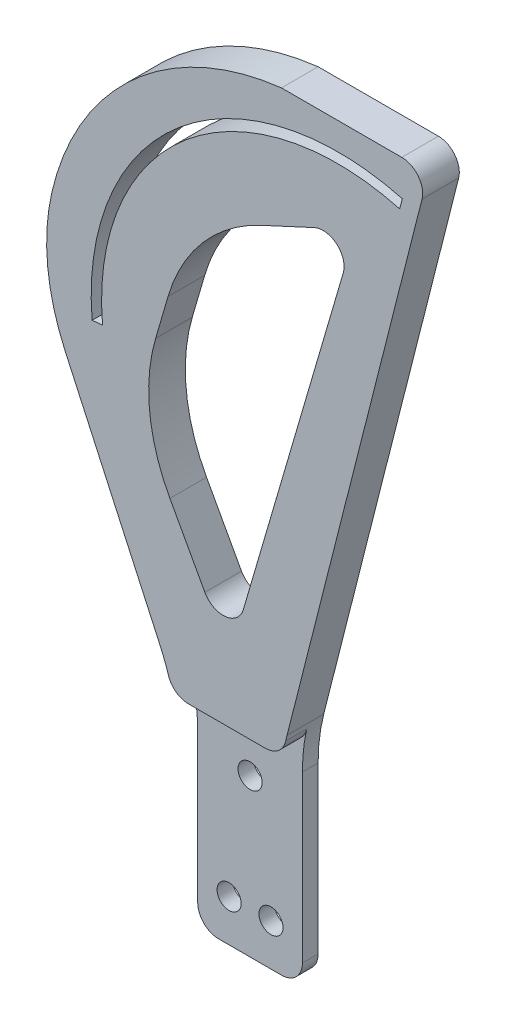
ISO-10303-21;
HEADER;
FILE_DESCRIPTION(('STEP AP214'),'2;1');
FILE_NAME('part.step','',(''),(''),'','','');
FILE_SCHEMA(('AUTOMOTIVE_DESIGN { 1 0 10303 214 1 1 1 1 }'));
ENDSEC;
DATA;
#1=APPLICATION_CONTEXT('core data for automotive mechanical design processes');
#2=APPLICATION_PROTOCOL_DEFINITION('international standard','automotive_design',2000,#1);
#3=PRODUCT_CONTEXT('',#1,'mechanical');
#4=PRODUCT('Part','Part','',(#3));
#5=PRODUCT_RELATED_PRODUCT_CATEGORY('part','',(#4));
#6=PRODUCT_DEFINITION_FORMATION('','',#4);
#7=PRODUCT_DEFINITION_CONTEXT('part definition',#1,'design');
#8=PRODUCT_DEFINITION('design','',#6,#7);
#9=PRODUCT_DEFINITION_SHAPE('','',#8);
#10=(LENGTH_UNIT() NAMED_UNIT(*) SI_UNIT(.MILLI.,.METRE.));
#11=(NAMED_UNIT(*) PLANE_ANGLE_UNIT() SI_UNIT($,.RADIAN.));
#12=(NAMED_UNIT(*) SI_UNIT($,.STERADIAN.) SOLID_ANGLE_UNIT());
#13=UNCERTAINTY_MEASURE_WITH_UNIT(LENGTH_MEASURE(1.E-05),#10,'distance_accuracy_value','');
#14=(GEOMETRIC_REPRESENTATION_CONTEXT(3) GLOBAL_UNCERTAINTY_ASSIGNED_CONTEXT((#13)) GLOBAL_UNIT_ASSIGNED_CONTEXT((#10,
#11,#12)) REPRESENTATION_CONTEXT('',''));
#15=CARTESIAN_POINT('',(0.,0.,0.));
#16=DIRECTION('',(0.,0.,1.));
#17=DIRECTION('',(1.,0.,0.));
#18=AXIS2_PLACEMENT_3D('',#15,#16,#17);
#19=CARTESIAN_POINT('',(10.,40.,7.));
#20=DIRECTION('',(-1.,0.,0.));
#21=DIRECTION('',(0.,0.,1.));
#22=AXIS2_PLACEMENT_3D('',#19,#20,#21);
#23=PLANE('',#22);
#24=DIRECTION('',(0.,1.,0.));
#25=VECTOR('',#24,1.);
#26=CARTESIAN_POINT('',(10.,40.,3.));
#27=LINE('',#26,#25);
#28=CARTESIAN_POINT('',(10.,4.,3.));
#29=VERTEX_POINT('',#28);
#30=CARTESIAN_POINT('',(10.,35.6273984666318,3.));
#31=VERTEX_POINT('',#30);
#32=EDGE_CURVE('E242',#29,#31,#27,.T.);
#33=ORIENTED_EDGE('',*,*,#32,.F.);
#34=DIRECTION('',(0.,0.,-1.));
#35=VECTOR('',#34,1.);
#36=CARTESIAN_POINT('',(10.,4.,7.));
#37=LINE('',#36,#35);
#38=CARTESIAN_POINT('',(10.,4.,0.));
#39=VERTEX_POINT('',#38);
#40=EDGE_CURVE('E251',#29,#39,#37,.T.);
#41=ORIENTED_EDGE('',*,*,#40,.T.);
#42=DIRECTION('',(0.,1.,0.));
#43=VECTOR('',#42,1.);
#44=CARTESIAN_POINT('',(10.,40.,0.));
#45=LINE('',#44,#43);
#46=CARTESIAN_POINT('',(10.,35.6273984666318,0.));
#47=VERTEX_POINT('',#46);
#48=EDGE_CURVE('E342',#39,#47,#45,.T.);
#49=ORIENTED_EDGE('',*,*,#48,.T.);
#50=DIRECTION('',(0.,0.,-1.));
#51=VECTOR('',#50,1.);
#52=CARTESIAN_POINT('',(10.,35.6273984666318,7.));
#53=LINE('',#52,#51);
#54=EDGE_CURVE('E283',#47,#31,#53,.F.);
#55=ORIENTED_EDGE('',*,*,#54,.T.);
#56=EDGE_LOOP('',(#33,#41,#49,#55));
#57=FACE_BOUND('',#56,.T.);
#58=ADVANCED_FACE('F31',(#57),#23,.F.);
#59=CARTESIAN_POINT('',(-10.,0.,7.));
#60=DIRECTION('',(1.,0.,0.));
#61=DIRECTION('',(0.,0.,-1.));
#62=AXIS2_PLACEMENT_3D('',#59,#60,#61);
#63=PLANE('',#62);
#64=DIRECTION('',(0.,-1.,0.));
#65=VECTOR('',#64,1.);
#66=CARTESIAN_POINT('',(-10.,0.,3.));
#67=LINE('',#66,#65);
#68=CARTESIAN_POINT('',(-10.,32.3714301403582,3.));
#69=VERTEX_POINT('',#68);
#70=CARTESIAN_POINT('',(-10.,4.,3.));
#71=VERTEX_POINT('',#70);
#72=EDGE_CURVE('E227',#69,#71,#67,.T.);
#73=ORIENTED_EDGE('',*,*,#72,.F.);
#74=DIRECTION('',(0.,0.,-1.));
#75=VECTOR('',#74,1.);
#76=CARTESIAN_POINT('',(-10.,32.3714301403582,0.));
#77=LINE('',#76,#75);
#78=CARTESIAN_POINT('',(-10.,32.3714301403582,0.));
#79=VERTEX_POINT('',#78);
#80=EDGE_CURVE('E276',#69,#79,#77,.T.);
#81=ORIENTED_EDGE('',*,*,#80,.T.);
#82=DIRECTION('',(0.,-1.,0.));
#83=VECTOR('',#82,1.);
#84=CARTESIAN_POINT('',(-10.,0.,0.));
#85=LINE('',#84,#83);
#86=CARTESIAN_POINT('',(-10.,4.,0.));
#87=VERTEX_POINT('',#86);
#88=EDGE_CURVE('E356',#79,#87,#85,.T.);
#89=ORIENTED_EDGE('',*,*,#88,.T.);
#90=DIRECTION('',(0.,0.,-1.));
#91=VECTOR('',#90,1.);
#92=CARTESIAN_POINT('',(-10.,4.,7.));
#93=LINE('',#92,#91);
#94=EDGE_CURVE('E249',#87,#71,#93,.F.);
#95=ORIENTED_EDGE('',*,*,#94,.T.);
#96=EDGE_LOOP('',(#73,#81,#89,#95));
#97=FACE_BOUND('',#96,.T.);
#98=ADVANCED_FACE('F424',(#97),#63,.F.);
#99=CARTESIAN_POINT('',(-10.,0.,7.));
#100=DIRECTION('',(0.,1.,0.));
#101=DIRECTION('',(0.,0.,1.));
#102=AXIS2_PLACEMENT_3D('',#99,#100,#101);
#103=PLANE('',#102);
#104=DIRECTION('',(1.,0.,0.));
#105=VECTOR('',#104,1.);
#106=CARTESIAN_POINT('',(16.3557713550586,0.,3.));
#107=LINE('',#106,#105);
#108=CARTESIAN_POINT('',(-6.,0.,3.));
#109=VERTEX_POINT('',#108);
#110=CARTESIAN_POINT('',(6.,0.,3.));
#111=VERTEX_POINT('',#110);
#112=EDGE_CURVE('E224',#109,#111,#107,.T.);
#113=ORIENTED_EDGE('',*,*,#112,.F.);
#114=DIRECTION('',(0.,0.,-1.));
#115=VECTOR('',#114,1.);
#116=CARTESIAN_POINT('',(-6.,0.,7.));
#117=LINE('',#116,#115);
#118=CARTESIAN_POINT('',(-6.,0.,0.));
#119=VERTEX_POINT('',#118);
#120=EDGE_CURVE('E238',#109,#119,#117,.T.);
#121=ORIENTED_EDGE('',*,*,#120,.T.);
#122=DIRECTION('',(1.,0.,0.));
#123=VECTOR('',#122,1.);
#124=CARTESIAN_POINT('',(-10.,0.,0.));
#125=LINE('',#124,#123);
#126=CARTESIAN_POINT('',(6.,0.,0.));
#127=VERTEX_POINT('',#126);
#128=EDGE_CURVE('E358',#119,#127,#125,.T.);
#129=ORIENTED_EDGE('',*,*,#128,.T.);
#130=DIRECTION('',(0.,0.,-1.));
#131=VECTOR('',#130,1.);
#132=CARTESIAN_POINT('',(6.,0.,7.));
#133=LINE('',#132,#131);
#134=EDGE_CURVE('E241',#127,#111,#133,.F.);
#135=ORIENTED_EDGE('',*,*,#134,.T.);
#136=EDGE_LOOP('',(#113,#121,#129,#135));
#137=FACE_BOUND('',#136,.T.);
#138=ADVANCED_FACE('F236',(#137),#103,.F.);
#139=CARTESIAN_POINT('',(0.,30.,7.));
#140=DIRECTION('',(0.,0.,-1.));
#141=DIRECTION('',(-1.,0.,0.));
#142=AXIS2_PLACEMENT_3D('',#139,#140,#141);
#143=CYLINDRICAL_SURFACE('',#142,2.3);
#144=CARTESIAN_POINT('',(0.,30.,0.));
#145=DIRECTION('',(0.,0.,1.));
#146=DIRECTION('',(1.,0.,0.));
#147=AXIS2_PLACEMENT_3D('',#144,#145,#146);
#148=CIRCLE('',#147,2.3);
#149=CARTESIAN_POINT('',(2.3,30.,0.));
#150=VERTEX_POINT('',#149);
#151=EDGE_CURVE('E475',#150,#150,#148,.T.);
#152=ORIENTED_EDGE('',*,*,#151,.F.);
#153=EDGE_LOOP('',(#152));
#154=FACE_BOUND('',#153,.T.);
#155=CARTESIAN_POINT('',(0.,30.,3.));
#156=DIRECTION('',(0.,0.,1.));
#157=DIRECTION('',(1.,0.,0.));
#158=AXIS2_PLACEMENT_3D('',#155,#156,#157);
#159=CIRCLE('',#158,2.3);
#160=CARTESIAN_POINT('',(2.3,30.,3.));
#161=VERTEX_POINT('',#160);
#162=EDGE_CURVE('E435',#161,#161,#159,.T.);
#163=ORIENTED_EDGE('',*,*,#162,.T.);
#164=EDGE_LOOP('',(#163));
#165=FACE_BOUND('',#164,.T.);
#166=ADVANCED_FACE('F621',(#154,#165),#143,.F.);
#167=CARTESIAN_POINT('',(4.,8.,7.));
#168=DIRECTION('',(0.,0.,-1.));
#169=DIRECTION('',(-1.,0.,0.));
#170=AXIS2_PLACEMENT_3D('',#167,#168,#169);
#171=CYLINDRICAL_SURFACE('',#170,2.3);
#172=CARTESIAN_POINT('',(4.,8.,0.));
#173=DIRECTION('',(0.,0.,1.));
#174=DIRECTION('',(1.,0.,0.));
#175=AXIS2_PLACEMENT_3D('',#172,#173,#174);
#176=CIRCLE('',#175,2.3);
#177=CARTESIAN_POINT('',(6.3,8.,0.));
#178=VERTEX_POINT('',#177);
#179=EDGE_CURVE('E472',#178,#178,#176,.T.);
#180=ORIENTED_EDGE('',*,*,#179,.F.);
#181=EDGE_LOOP('',(#180));
#182=FACE_BOUND('',#181,.T.);
#183=CARTESIAN_POINT('',(4.,8.,3.));
#184=DIRECTION('',(0.,0.,1.));
#185=DIRECTION('',(1.,0.,0.));
#186=AXIS2_PLACEMENT_3D('',#183,#184,#185);
#187=CIRCLE('',#186,2.3);
#188=CARTESIAN_POINT('',(6.3,8.,3.));
#189=VERTEX_POINT('',#188);
#190=EDGE_CURVE('E432',#189,#189,#187,.T.);
#191=ORIENTED_EDGE('',*,*,#190,.T.);
#192=EDGE_LOOP('',(#191));
#193=FACE_BOUND('',#192,.T.);
#194=ADVANCED_FACE('F617',(#182,#193),#171,.F.);
#195=CARTESIAN_POINT('',(-4.,8.,7.));
#196=DIRECTION('',(0.,0.,-1.));
#197=DIRECTION('',(-1.,0.,0.));
#198=AXIS2_PLACEMENT_3D('',#195,#196,#197);
#199=CYLINDRICAL_SURFACE('',#198,2.3);
#200=CARTESIAN_POINT('',(-4.,8.,0.));
#201=DIRECTION('',(0.,0.,1.));
#202=DIRECTION('',(1.,0.,0.));
#203=AXIS2_PLACEMENT_3D('',#200,#201,#202);
#204=CIRCLE('',#203,2.3);
#205=CARTESIAN_POINT('',(-1.7,8.,0.));
#206=VERTEX_POINT('',#205);
#207=EDGE_CURVE('E469',#206,#206,#204,.T.);
#208=ORIENTED_EDGE('',*,*,#207,.F.);
#209=EDGE_LOOP('',(#208));
#210=FACE_BOUND('',#209,.T.);
#211=CARTESIAN_POINT('',(-4.,8.,3.));
#212=DIRECTION('',(0.,0.,1.));
#213=DIRECTION('',(1.,0.,0.));
#214=AXIS2_PLACEMENT_3D('',#211,#212,#213);
#215=CIRCLE('',#214,2.3);
#216=CARTESIAN_POINT('',(-1.7,8.,3.));
#217=VERTEX_POINT('',#216);
#218=EDGE_CURVE('E232',#217,#217,#215,.T.);
#219=ORIENTED_EDGE('',*,*,#218,.T.);
#220=EDGE_LOOP('',(#219));
#221=FACE_BOUND('',#220,.T.);
#222=ADVANCED_FACE('F571',(#210,#221),#199,.F.);
#223=CARTESIAN_POINT('',(-6.,4.,7.));
#224=DIRECTION('',(0.,0.,-1.));
#225=DIRECTION('',(-1.,0.,0.));
#226=AXIS2_PLACEMENT_3D('',#223,#224,#225);
#227=CYLINDRICAL_SURFACE('',#226,4.);
#228=ORIENTED_EDGE('',*,*,#120,.F.);
#229=CARTESIAN_POINT('',(-6.,4.,3.));
#230=DIRECTION('',(0.,0.,1.));
#231=DIRECTION('',(1.,0.,0.));
#232=AXIS2_PLACEMENT_3D('',#229,#230,#231);
#233=CIRCLE('',#232,4.);
#234=EDGE_CURVE('E221',#109,#71,#233,.F.);
#235=ORIENTED_EDGE('',*,*,#234,.T.);
#236=ORIENTED_EDGE('',*,*,#94,.F.);
#237=CARTESIAN_POINT('',(-6.,4.,0.));
#238=DIRECTION('',(0.,0.,1.));
#239=DIRECTION('',(1.,0.,0.));
#240=AXIS2_PLACEMENT_3D('',#237,#238,#239);
#241=CIRCLE('',#240,4.);
#242=EDGE_CURVE('E247',#119,#87,#241,.F.);
#243=ORIENTED_EDGE('',*,*,#242,.F.);
#244=EDGE_LOOP('',(#228,#235,#236,#243));
#245=FACE_BOUND('',#244,.T.);
#246=ADVANCED_FACE('F245',(#245),#227,.T.);
#247=CARTESIAN_POINT('',(6.,4.,7.));
#248=DIRECTION('',(0.,0.,-1.));
#249=DIRECTION('',(-1.,0.,0.));
#250=AXIS2_PLACEMENT_3D('',#247,#248,#249);
#251=CYLINDRICAL_SURFACE('',#250,4.);
#252=ORIENTED_EDGE('',*,*,#40,.F.);
#253=CARTESIAN_POINT('',(6.,4.,3.));
#254=DIRECTION('',(0.,0.,1.));
#255=DIRECTION('',(1.,0.,0.));
#256=AXIS2_PLACEMENT_3D('',#253,#254,#255);
#257=CIRCLE('',#256,4.);
#258=EDGE_CURVE('E426',#29,#111,#257,.F.);
#259=ORIENTED_EDGE('',*,*,#258,.T.);
#260=ORIENTED_EDGE('',*,*,#134,.F.);
#261=CARTESIAN_POINT('',(6.,4.,0.));
#262=DIRECTION('',(0.,0.,1.));
#263=DIRECTION('',(1.,0.,0.));
#264=AXIS2_PLACEMENT_3D('',#261,#262,#263);
#265=CIRCLE('',#264,4.);
#266=EDGE_CURVE('E389',#39,#127,#265,.F.);
#267=ORIENTED_EDGE('',*,*,#266,.F.);
#268=EDGE_LOOP('',(#252,#259,#260,#267));
#269=FACE_BOUND('',#268,.T.);
#270=ADVANCED_FACE('F570',(#269),#251,.T.);
#271=CARTESIAN_POINT('',(15.8483914987407,100.113681249051,7.));
#272=DIRECTION('',(0.,0.,1.));
#273=DIRECTION('',(1.,0.,0.));
#274=AXIS2_PLACEMENT_3D('',#271,#272,#273);
#275=PLANE('',#274);
#276=CARTESIAN_POINT('',(-45.,32.3714301403582,7.));
#277=DIRECTION('',(0.,0.,1.));
#278=DIRECTION('',(1.,0.,0.));
#279=AXIS2_PLACEMENT_3D('',#276,#277,#278);
#280=CIRCLE('',#279,35.);
#281=CARTESIAN_POINT('',(-13.1746189934436,46.9366326376638,7.));
#282=VERTEX_POINT('',#281);
#283=CARTESIAN_POINT('',(-11.5920357684698,42.8073261682419,7.));
#284=VERTEX_POINT('',#283);
#285=EDGE_CURVE('E288',#282,#284,#280,.F.);
#286=ORIENTED_EDGE('',*,*,#285,.T.);
#287=CARTESIAN_POINT('',(-7.77398271343778,44.,7.));
#288=DIRECTION('',(0.,0.,1.));
#289=DIRECTION('',(1.,0.,0.));
#290=AXIS2_PLACEMENT_3D('',#287,#288,#289);
#291=CIRCLE('',#290,4.);
#292=CARTESIAN_POINT('',(-7.77398271343778,40.,7.));
#293=VERTEX_POINT('',#292);
#294=EDGE_CURVE('E301',#284,#293,#291,.T.);
#295=ORIENTED_EDGE('',*,*,#294,.T.);
#296=DIRECTION('',(-1.,0.,0.));
#297=VECTOR('',#296,1.);
#298=CARTESIAN_POINT('',(16.3557713550586,40.,7.));
#299=LINE('',#298,#297);
#300=CARTESIAN_POINT('',(6.90932471636347,40.,7.));
#301=VERTEX_POINT('',#300);
#302=EDGE_CURVE('E852',#301,#293,#299,.T.);
#303=ORIENTED_EDGE('',*,*,#302,.F.);
#304=CARTESIAN_POINT('',(6.90932471636347,44.,7.));
#305=DIRECTION('',(0.,0.,1.));
#306=DIRECTION('',(1.,0.,0.));
#307=AXIS2_PLACEMENT_3D('',#304,#305,#306);
#308=CIRCLE('',#307,4.);
#309=CARTESIAN_POINT('',(10.8160606428903,43.1412716376033,7.));
#310=VERTEX_POINT('',#309);
#311=EDGE_CURVE('E299',#301,#310,#308,.T.);
#312=ORIENTED_EDGE('',*,*,#311,.T.);
#313=CARTESIAN_POINT('',(45.,35.6273984666318,7.));
#314=DIRECTION('',(0.,0.,1.));
#315=DIRECTION('',(1.,0.,0.));
#316=AXIS2_PLACEMENT_3D('',#313,#314,#315);
#317=CIRCLE('',#316,35.);
#318=CARTESIAN_POINT('',(11.0757607583363,44.2382051578986,7.));
#319=VERTEX_POINT('',#318);
#320=EDGE_CURVE('E293',#310,#319,#317,.F.);
#321=ORIENTED_EDGE('',*,*,#320,.T.);
#322=DIRECTION('',(0.246023048321909,0.969263978333248,0.));
#323=VECTOR('',#322,1.);
#324=CARTESIAN_POINT('',(38.1230361732267,150.797122911854,7.));
#325=LINE('',#324,#323);
#326=CARTESIAN_POINT('',(36.8579509313108,145.813030718567,7.));
#327=VERTEX_POINT('',#326);
#328=EDGE_CURVE('E359',#319,#327,#325,.T.);
#329=ORIENTED_EDGE('',*,*,#328,.T.);
#330=CARTESIAN_POINT('',(32.9808950179779,146.797122911854,7.));
#331=DIRECTION('',(0.,0.,1.));
#332=DIRECTION('',(1.,0.,0.));
#333=AXIS2_PLACEMENT_3D('',#330,#331,#332);
#334=CIRCLE('',#333,4.);
#335=CARTESIAN_POINT('',(32.9808950179779,150.797122911854,7.));
#336=VERTEX_POINT('',#335);
#337=EDGE_CURVE('E253',#327,#336,#334,.T.);
#338=ORIENTED_EDGE('',*,*,#337,.T.);
#339=DIRECTION('',(-1.,0.,0.));
#340=VECTOR('',#339,1.);
#341=CARTESIAN_POINT('',(10.,150.797122911854,7.));
#342=LINE('',#341,#340);
#343=CARTESIAN_POINT('',(10.,150.797122911854,7.));
#344=VERTEX_POINT('',#343);
#345=EDGE_CURVE('E338',#336,#344,#342,.T.);
#346=ORIENTED_EDGE('',*,*,#345,.T.);
#347=CARTESIAN_POINT('',(15.8483914987407,100.113681249051,7.));
#348=DIRECTION('',(0.,0.,1.));
#349=DIRECTION('',(1.,0.,0.));
#350=AXIS2_PLACEMENT_3D('',#347,#348,#349);
#351=CIRCLE('',#350,51.0197505081054);
#352=CARTESIAN_POINT('',(-33.85729029443,111.61846892138,7.));
#353=VERTEX_POINT('',#352);
#354=EDGE_CURVE('E333',#344,#353,#351,.T.);
#355=ORIENTED_EDGE('',*,*,#354,.T.);
#356=CARTESIAN_POINT('',(4.13822263199424,102.824095864821,7.));
#357=DIRECTION('',(0.,0.,1.));
#358=DIRECTION('',(1.,0.,0.));
#359=AXIS2_PLACEMENT_3D('',#356,#357,#358);
#360=CIRCLE('',#359,39.);
#361=CARTESIAN_POINT('',(-31.3243447753115,86.594298796395,7.));
#362=VERTEX_POINT('',#361);
#363=EDGE_CURVE('E328',#353,#362,#360,.T.);
#364=ORIENTED_EDGE('',*,*,#363,.T.);
#365=DIRECTION('',(0.416148642780162,-0.909296600187326,0.));
#366=VECTOR('',#365,1.);
#367=CARTESIAN_POINT('',(-34.8350501640625,94.26528975031,7.));
#368=LINE('',#367,#366);
#369=EDGE_CURVE('E325',#362,#282,#368,.T.);
#370=ORIENTED_EDGE('',*,*,#369,.T.);
#371=EDGE_LOOP('',(#286,#295,#303,#312,#321,#329,#338,#346,#355,#364,#370));
#372=FACE_BOUND('',#371,.T.);
#373=DIRECTION('',(-0.28080661807716,-0.959764368605163,0.));
#374=VECTOR('',#373,1.);
#375=CARTESIAN_POINT('',(-17.8772836180474,84.2204503935574,7.));
#376=LINE('',#375,#374);
#377=CARTESIAN_POINT('',(-11.6665246986277,105.448102197753,7.));
#378=VERTEX_POINT('',#377);
#379=CARTESIAN_POINT('',(-14.0389246008618,97.3395151927952,7.));
#380=VERTEX_POINT('',#379);
#381=EDGE_CURVE('E481',#378,#380,#376,.T.);
#382=ORIENTED_EDGE('',*,*,#381,.F.);
#383=CARTESIAN_POINT('',(20.0056994653428,96.1814838012071,7.));
#384=DIRECTION('',(0.,0.,1.));
#385=DIRECTION('',(1.,0.,0.));
#386=AXIS2_PLACEMENT_3D('',#383,#384,#385);
#387=CIRCLE('',#386,33.);
#388=CARTESIAN_POINT('',(6.14485163616953,126.129386857289,7.));
#389=VERTEX_POINT('',#388);
#390=EDGE_CURVE('E383',#378,#389,#387,.F.);
#391=ORIENTED_EDGE('',*,*,#390,.T.);
#392=DIRECTION('',(-0.907512213820676,-0.420025691793127,0.));
#393=VECTOR('',#392,1.);
#394=CARTESIAN_POINT('',(-7.45759337681556,119.833740044335,7.));
#395=LINE('',#394,#393);
#396=CARTESIAN_POINT('',(16.2814778140201,130.820941811547,7.));
#397=VERTEX_POINT('',#396);
#398=EDGE_CURVE('E479',#397,#389,#395,.T.);
#399=ORIENTED_EDGE('',*,*,#398,.F.);
#400=CARTESIAN_POINT('',(17.9615805811926,127.190892956265,7.));
#401=DIRECTION('',(0.,0.,1.));
#402=DIRECTION('',(1.,0.,0.));
#403=AXIS2_PLACEMENT_3D('',#400,#401,#402);
#404=CIRCLE('',#403,4.);
#405=CARTESIAN_POINT('',(21.8006380556133,126.067666483956,7.));
#406=VERTEX_POINT('',#405);
#407=EDGE_CURVE('E274',#397,#406,#404,.F.);
#408=ORIENTED_EDGE('',*,*,#407,.T.);
#409=DIRECTION('',(0.28080661807716,0.959764368605163,0.));
#410=VECTOR('',#409,1.);
#411=CARTESIAN_POINT('',(24.2735962238406,134.519949949239,7.));
#412=LINE('',#411,#410);
#413=CARTESIAN_POINT('',(2.71170858306392,60.8239251931592,7.));
#414=VERTEX_POINT('',#413);
#415=EDGE_CURVE('E346',#414,#406,#412,.T.);
#416=ORIENTED_EDGE('',*,*,#415,.F.);
#417=CARTESIAN_POINT('',(-1.12734889135673,61.9471516654679,7.));
#418=DIRECTION('',(0.,0.,1.));
#419=DIRECTION('',(1.,0.,0.));
#420=AXIS2_PLACEMENT_3D('',#417,#418,#419);
#421=CIRCLE('',#420,4.);
#422=CARTESIAN_POINT('',(-4.63621352026212,60.0267691473177,7.));
#423=VERTEX_POINT('',#422);
#424=EDGE_CURVE('E270',#414,#423,#421,.F.);
#425=ORIENTED_EDGE('',*,*,#424,.T.);
#426=DIRECTION('',(0.480095629537535,-0.877216157226346,0.));
#427=VECTOR('',#426,1.);
#428=CARTESIAN_POINT('',(0.,51.5556205716834,7.));
#429=LINE('',#428,#427);
#430=CARTESIAN_POINT('',(-11.3148336253608,72.2297410215103,7.));
#431=VERTEX_POINT('',#430);
#432=EDGE_CURVE('E485',#431,#423,#429,.T.);
#433=ORIENTED_EDGE('',*,*,#432,.F.);
#434=CARTESIAN_POINT('',(17.6332995631086,88.072896796249,7.));
#435=DIRECTION('',(0.,0.,1.));
#436=DIRECTION('',(1.,0.,0.));
#437=AXIS2_PLACEMENT_3D('',#434,#435,#436);
#438=CIRCLE('',#437,33.);
#439=EDGE_CURVE('E379',#431,#380,#438,.F.);
#440=ORIENTED_EDGE('',*,*,#439,.T.);
#441=EDGE_LOOP('',(#382,#391,#399,#408,#416,#425,#433,#440));
#442=FACE_BOUND('',#441,.T.);
#443=DIRECTION('',(0.99624966309352,0.0865251916267601,0.));
#444=VECTOR('',#443,1.);
#445=CARTESIAN_POINT('',(-26.1752314170329,94.26528975031,7.));
#446=LINE('',#445,#444);
#447=CARTESIAN_POINT('',(-26.1752314170329,94.26528975031,7.));
#448=VERTEX_POINT('',#447);
#449=CARTESIAN_POINT('',(-24.1827320908458,94.4383401335636,7.));
#450=VERTEX_POINT('',#449);
#451=EDGE_CURVE('E441',#448,#450,#446,.T.);
#452=ORIENTED_EDGE('',*,*,#451,.F.);
#453=CARTESIAN_POINT('',(20.8975651641359,98.3536050546746,7.));
#454=DIRECTION('',(0.,0.,1.));
#455=DIRECTION('',(1.,0.,0.));
#456=AXIS2_PLACEMENT_3D('',#453,#454,#455);
#457=CIRCLE('',#456,47.25);
#458=CARTESIAN_POINT('',(33.0978751166386,144.001331581445,7.));
#459=VERTEX_POINT('',#458);
#460=EDGE_CURVE('E439',#459,#448,#457,.T.);
#461=ORIENTED_EDGE('',*,*,#460,.F.);
#462=DIRECTION('',(0.25820761804239,0.966089450302028,0.));
#463=VECTOR('',#462,1.);
#464=CARTESIAN_POINT('',(32.5814598805539,142.069152680841,7.));
#465=LINE('',#464,#463);
#466=CARTESIAN_POINT('',(32.5814598805539,142.069152680841,7.));
#467=VERTEX_POINT('',#466);
#468=EDGE_CURVE('E447',#467,#459,#465,.T.);
#469=ORIENTED_EDGE('',*,*,#468,.F.);
#470=CARTESIAN_POINT('',(20.761079789929,98.5162619897222,7.));
#471=DIRECTION('',(0.,0.,-1.));
#472=DIRECTION('',(1.,0.,0.));
#473=AXIS2_PLACEMENT_3D('',#470,#471,#472);
#474=CIRCLE('',#473,45.1284353045773);
#475=EDGE_CURVE('E444',#450,#467,#474,.T.);
#476=ORIENTED_EDGE('',*,*,#475,.F.);
#477=EDGE_LOOP('',(#452,#461,#469,#476));
#478=FACE_BOUND('',#477,.T.);
#479=ADVANCED_FACE('F321',(#372,#442,#478),#275,.T.);
#480=CARTESIAN_POINT('',(15.8483914987407,100.113681249051,0.));
#481=DIRECTION('',(0.,0.,1.));
#482=DIRECTION('',(1.,0.,0.));
#483=AXIS2_PLACEMENT_3D('',#480,#481,#482);
#484=PLANE('',#483);
#485=ORIENTED_EDGE('',*,*,#207,.T.);
#486=EDGE_LOOP('',(#485));
#487=FACE_BOUND('',#486,.T.);
#488=ORIENTED_EDGE('',*,*,#151,.T.);
#489=EDGE_LOOP('',(#488));
#490=FACE_BOUND('',#489,.T.);
#491=DIRECTION('',(-1.,0.,0.));
#492=VECTOR('',#491,1.);
#493=CARTESIAN_POINT('',(10.,150.797122911854,0.));
#494=LINE('',#493,#492);
#495=CARTESIAN_POINT('',(32.9808950179779,150.797122911854,0.));
#496=VERTEX_POINT('',#495);
#497=CARTESIAN_POINT('',(10.,150.797122911854,0.));
#498=VERTEX_POINT('',#497);
#499=EDGE_CURVE('E348',#496,#498,#494,.T.);
#500=ORIENTED_EDGE('',*,*,#499,.F.);
#501=CARTESIAN_POINT('',(32.9808950179779,146.797122911854,0.));
#502=DIRECTION('',(0.,0.,1.));
#503=DIRECTION('',(1.,0.,0.));
#504=AXIS2_PLACEMENT_3D('',#501,#502,#503);
#505=CIRCLE('',#504,4.);
#506=CARTESIAN_POINT('',(36.8579509313108,145.813030718567,0.));
#507=VERTEX_POINT('',#506);
#508=EDGE_CURVE('E392',#496,#507,#505,.F.);
#509=ORIENTED_EDGE('',*,*,#508,.T.);
#510=DIRECTION('',(0.246023048321909,0.969263978333248,0.));
#511=VECTOR('',#510,1.);
#512=CARTESIAN_POINT('',(38.1230361732267,150.797122911854,0.));
#513=LINE('',#512,#511);
#514=CARTESIAN_POINT('',(11.0757607583363,44.2382051578986,0.));
#515=VERTEX_POINT('',#514);
#516=EDGE_CURVE('E345',#515,#507,#513,.T.);
#517=ORIENTED_EDGE('',*,*,#516,.F.);
#518=CARTESIAN_POINT('',(45.,35.6273984666318,0.));
#519=DIRECTION('',(0.,0.,1.));
#520=DIRECTION('',(1.,0.,0.));
#521=AXIS2_PLACEMENT_3D('',#518,#519,#520);
#522=CIRCLE('',#521,35.);
#523=EDGE_CURVE('E291',#515,#47,#522,.T.);
#524=ORIENTED_EDGE('',*,*,#523,.T.);
#525=ORIENTED_EDGE('',*,*,#48,.F.);
#526=ORIENTED_EDGE('',*,*,#266,.T.);
#527=ORIENTED_EDGE('',*,*,#128,.F.);
#528=ORIENTED_EDGE('',*,*,#242,.T.);
#529=ORIENTED_EDGE('',*,*,#88,.F.);
#530=CARTESIAN_POINT('',(-45.,32.3714301403582,0.));
#531=DIRECTION('',(0.,0.,1.));
#532=DIRECTION('',(1.,0.,0.));
#533=AXIS2_PLACEMENT_3D('',#530,#531,#532);
#534=CIRCLE('',#533,35.);
#535=CARTESIAN_POINT('',(-13.1746189934436,46.9366326376638,0.));
#536=VERTEX_POINT('',#535);
#537=EDGE_CURVE('E286',#79,#536,#534,.T.);
#538=ORIENTED_EDGE('',*,*,#537,.T.);
#539=DIRECTION('',(0.416148642780162,-0.909296600187326,0.));
#540=VECTOR('',#539,1.);
#541=CARTESIAN_POINT('',(-34.8350501640625,94.26528975031,0.));
#542=LINE('',#541,#540);
#543=CARTESIAN_POINT('',(-31.3243447753115,86.594298796395,0.));
#544=VERTEX_POINT('',#543);
#545=EDGE_CURVE('E353',#544,#536,#542,.T.);
#546=ORIENTED_EDGE('',*,*,#545,.F.);
#547=CARTESIAN_POINT('',(4.13822263199424,102.824095864821,0.));
#548=DIRECTION('',(0.,0.,1.));
#549=DIRECTION('',(1.,0.,0.));
#550=AXIS2_PLACEMENT_3D('',#547,#548,#549);
#551=CIRCLE('',#550,39.);
#552=CARTESIAN_POINT('',(-33.85729029443,111.61846892138,0.));
#553=VERTEX_POINT('',#552);
#554=EDGE_CURVE('E362',#544,#553,#551,.F.);
#555=ORIENTED_EDGE('',*,*,#554,.T.);
#556=CARTESIAN_POINT('',(15.8483914987407,100.113681249051,0.));
#557=DIRECTION('',(0.,0.,1.));
#558=DIRECTION('',(1.,0.,0.));
#559=AXIS2_PLACEMENT_3D('',#556,#557,#558);
#560=CIRCLE('',#559,51.0197505081054);
#561=EDGE_CURVE('E350',#498,#553,#560,.T.);
#562=ORIENTED_EDGE('',*,*,#561,.F.);
#563=EDGE_LOOP('',(#500,#509,#517,#524,#525,#526,#527,#528,#529,#538,#546,#555,#562));
#564=FACE_BOUND('',#563,.T.);
#565=DIRECTION('',(0.28080661807716,0.959764368605163,0.));
#566=VECTOR('',#565,1.);
#567=CARTESIAN_POINT('',(24.2735962238406,134.519949949239,0.));
#568=LINE('',#567,#566);
#569=CARTESIAN_POINT('',(2.71170858306392,60.8239251931592,0.));
#570=VERTEX_POINT('',#569);
#571=CARTESIAN_POINT('',(21.8006380556133,126.067666483956,0.));
#572=VERTEX_POINT('',#571);
#573=EDGE_CURVE('E482',#570,#572,#568,.T.);
#574=ORIENTED_EDGE('',*,*,#573,.T.);
#575=CARTESIAN_POINT('',(17.9615805811926,127.190892956265,0.));
#576=DIRECTION('',(0.,0.,1.));
#577=DIRECTION('',(1.,0.,0.));
#578=AXIS2_PLACEMENT_3D('',#575,#576,#577);
#579=CIRCLE('',#578,4.);
#580=CARTESIAN_POINT('',(16.2814778140201,130.820941811547,0.));
#581=VERTEX_POINT('',#580);
#582=EDGE_CURVE('E272',#572,#581,#579,.T.);
#583=ORIENTED_EDGE('',*,*,#582,.T.);
#584=DIRECTION('',(-0.907512213820676,-0.420025691793127,0.));
#585=VECTOR('',#584,1.);
#586=CARTESIAN_POINT('',(-7.45759337681556,119.833740044335,0.));
#587=LINE('',#586,#585);
#588=CARTESIAN_POINT('',(6.14485163616953,126.129386857289,0.));
#589=VERTEX_POINT('',#588);
#590=EDGE_CURVE('E478',#581,#589,#587,.T.);
#591=ORIENTED_EDGE('',*,*,#590,.T.);
#592=CARTESIAN_POINT('',(20.0056994653428,96.1814838012071,0.));
#593=DIRECTION('',(0.,0.,1.));
#594=DIRECTION('',(1.,0.,0.));
#595=AXIS2_PLACEMENT_3D('',#592,#593,#594);
#596=CIRCLE('',#595,33.);
#597=CARTESIAN_POINT('',(-11.6665246986277,105.448102197753,0.));
#598=VERTEX_POINT('',#597);
#599=EDGE_CURVE('E381',#589,#598,#596,.T.);
#600=ORIENTED_EDGE('',*,*,#599,.T.);
#601=DIRECTION('',(-0.28080661807716,-0.959764368605163,0.));
#602=VECTOR('',#601,1.);
#603=CARTESIAN_POINT('',(-17.8772836180474,84.2204503935574,0.));
#604=LINE('',#603,#602);
#605=CARTESIAN_POINT('',(-14.0389246008618,97.3395151927952,0.));
#606=VERTEX_POINT('',#605);
#607=EDGE_CURVE('E491',#598,#606,#604,.T.);
#608=ORIENTED_EDGE('',*,*,#607,.T.);
#609=CARTESIAN_POINT('',(17.6332995631086,88.072896796249,0.));
#610=DIRECTION('',(0.,0.,1.));
#611=DIRECTION('',(1.,0.,0.));
#612=AXIS2_PLACEMENT_3D('',#609,#610,#611);
#613=CIRCLE('',#612,33.);
#614=CARTESIAN_POINT('',(-11.3148336253608,72.2297410215103,0.));
#615=VERTEX_POINT('',#614);
#616=EDGE_CURVE('E377',#606,#615,#613,.T.);
#617=ORIENTED_EDGE('',*,*,#616,.T.);
#618=DIRECTION('',(0.480095629537535,-0.877216157226346,0.));
#619=VECTOR('',#618,1.);
#620=CARTESIAN_POINT('',(0.,51.5556205716834,0.));
#621=LINE('',#620,#619);
#622=CARTESIAN_POINT('',(-4.63621352026212,60.0267691473177,0.));
#623=VERTEX_POINT('',#622);
#624=EDGE_CURVE('E494',#615,#623,#621,.T.);
#625=ORIENTED_EDGE('',*,*,#624,.T.);
#626=CARTESIAN_POINT('',(-1.12734889135673,61.9471516654679,0.));
#627=DIRECTION('',(0.,0.,1.));
#628=DIRECTION('',(1.,0.,0.));
#629=AXIS2_PLACEMENT_3D('',#626,#627,#628);
#630=CIRCLE('',#629,4.);
#631=EDGE_CURVE('E268',#623,#570,#630,.T.);
#632=ORIENTED_EDGE('',*,*,#631,.T.);
#633=EDGE_LOOP('',(#574,#583,#591,#600,#608,#617,#625,#632));
#634=FACE_BOUND('',#633,.T.);
#635=ORIENTED_EDGE('',*,*,#179,.T.);
#636=EDGE_LOOP('',(#635));
#637=FACE_BOUND('',#636,.T.);
#638=CARTESIAN_POINT('',(20.8975651641359,98.3536050546746,0.));
#639=DIRECTION('',(0.,0.,1.));
#640=DIRECTION('',(1.,0.,0.));
#641=AXIS2_PLACEMENT_3D('',#638,#639,#640);
#642=CIRCLE('',#641,47.25);
#643=CARTESIAN_POINT('',(33.0978751166387,144.001331581445,0.));
#644=VERTEX_POINT('',#643);
#645=CARTESIAN_POINT('',(-26.1752314170329,94.26528975031,0.));
#646=VERTEX_POINT('',#645);
#647=EDGE_CURVE('E438',#644,#646,#642,.T.);
#648=ORIENTED_EDGE('',*,*,#647,.T.);
#649=DIRECTION('',(0.99624966309352,0.0865251916267601,0.));
#650=VECTOR('',#649,1.);
#651=CARTESIAN_POINT('',(-26.1752314170329,94.26528975031,0.));
#652=LINE('',#651,#650);
#653=CARTESIAN_POINT('',(-24.1827320908458,94.4383401335636,0.));
#654=VERTEX_POINT('',#653);
#655=EDGE_CURVE('E452',#646,#654,#652,.T.);
#656=ORIENTED_EDGE('',*,*,#655,.T.);
#657=CARTESIAN_POINT('',(20.761079789929,98.5162619897222,0.));
#658=DIRECTION('',(0.,0.,-1.));
#659=DIRECTION('',(1.,0.,0.));
#660=AXIS2_PLACEMENT_3D('',#657,#658,#659);
#661=CIRCLE('',#660,45.1284353045773);
#662=CARTESIAN_POINT('',(32.5814598805539,142.069152680841,0.));
#663=VERTEX_POINT('',#662);
#664=EDGE_CURVE('E455',#654,#663,#661,.T.);
#665=ORIENTED_EDGE('',*,*,#664,.T.);
#666=DIRECTION('',(0.25820761804239,0.966089450302028,0.));
#667=VECTOR('',#666,1.);
#668=CARTESIAN_POINT('',(32.5814598805539,142.069152680841,0.));
#669=LINE('',#668,#667);
#670=EDGE_CURVE('E442',#663,#644,#669,.T.);
#671=ORIENTED_EDGE('',*,*,#670,.T.);
#672=EDGE_LOOP('',(#648,#656,#665,#671));
#673=FACE_BOUND('',#672,.T.);
#674=ADVANCED_FACE('F411',(#487,#490,#564,#634,#637,#673),#484,.F.);
#675=CARTESIAN_POINT('',(38.1230361732267,150.797122911854,7.));
#676=DIRECTION('',(-0.969263978333248,0.246023048321909,0.));
#677=DIRECTION('',(-0.246023048321909,-0.969263978333248,0.));
#678=AXIS2_PLACEMENT_3D('',#675,#676,#677);
#679=PLANE('',#678);
#680=ORIENTED_EDGE('',*,*,#328,.F.);
#681=DIRECTION('',(0.,0.,-1.));
#682=VECTOR('',#681,1.);
#683=CARTESIAN_POINT('',(11.0757607583363,44.2382051578986,0.));
#684=LINE('',#683,#682);
#685=EDGE_CURVE('E280',#319,#515,#684,.T.);
#686=ORIENTED_EDGE('',*,*,#685,.T.);
#687=ORIENTED_EDGE('',*,*,#516,.T.);
#688=DIRECTION('',(0.,0.,-1.));
#689=VECTOR('',#688,1.);
#690=CARTESIAN_POINT('',(36.8579509313108,145.813030718567,7.));
#691=LINE('',#690,#689);
#692=EDGE_CURVE('E395',#507,#327,#691,.F.);
#693=ORIENTED_EDGE('',*,*,#692,.T.);
#694=EDGE_LOOP('',(#680,#686,#687,#693));
#695=FACE_BOUND('',#694,.T.);
#696=ADVANCED_FACE('F557',(#695),#679,.F.);
#697=CARTESIAN_POINT('',(10.,150.797122911854,7.));
#698=DIRECTION('',(0.,-1.,0.));
#699=DIRECTION('',(0.,0.,-1.));
#700=AXIS2_PLACEMENT_3D('',#697,#698,#699);
#701=PLANE('',#700);
#702=ORIENTED_EDGE('',*,*,#345,.F.);
#703=DIRECTION('',(0.,0.,-1.));
#704=VECTOR('',#703,1.);
#705=CARTESIAN_POINT('',(32.9808950179779,150.797122911854,7.));
#706=LINE('',#705,#704);
#707=EDGE_CURVE('E386',#336,#496,#706,.T.);
#708=ORIENTED_EDGE('',*,*,#707,.T.);
#709=ORIENTED_EDGE('',*,*,#499,.T.);
#710=DIRECTION('',(0.,0.,-1.));
#711=VECTOR('',#710,1.);
#712=CARTESIAN_POINT('',(10.,150.797122911854,7.));
#713=LINE('',#712,#711);
#714=EDGE_CURVE('E332',#344,#498,#713,.T.);
#715=ORIENTED_EDGE('',*,*,#714,.F.);
#716=EDGE_LOOP('',(#702,#708,#709,#715));
#717=FACE_BOUND('',#716,.T.);
#718=ADVANCED_FACE('F405',(#717),#701,.F.);
#719=CARTESIAN_POINT('',(15.8483914987407,100.113681249051,7.));
#720=DIRECTION('',(0.,0.,-1.));
#721=DIRECTION('',(-1.,0.,0.));
#722=AXIS2_PLACEMENT_3D('',#719,#720,#721);
#723=CYLINDRICAL_SURFACE('',#722,51.0197505081054);
#724=ORIENTED_EDGE('',*,*,#561,.T.);
#725=DIRECTION('',(0.,0.,-1.));
#726=VECTOR('',#725,1.);
#727=CARTESIAN_POINT('',(-33.85729029443,111.61846892138,7.));
#728=LINE('',#727,#726);
#729=EDGE_CURVE('E364',#553,#353,#728,.F.);
#730=ORIENTED_EDGE('',*,*,#729,.T.);
#731=ORIENTED_EDGE('',*,*,#354,.F.);
#732=ORIENTED_EDGE('',*,*,#714,.T.);
#733=EDGE_LOOP('',(#724,#730,#731,#732));
#734=FACE_BOUND('',#733,.T.);
#735=ADVANCED_FACE('F415',(#734),#723,.T.);
#736=CARTESIAN_POINT('',(-34.8350501640625,94.26528975031,7.));
#737=DIRECTION('',(0.909296600187326,0.416148642780162,0.));
#738=DIRECTION('',(-0.416148642780162,0.909296600187326,0.));
#739=AXIS2_PLACEMENT_3D('',#736,#737,#738);
#740=PLANE('',#739);
#741=ORIENTED_EDGE('',*,*,#545,.T.);
#742=DIRECTION('',(0.,0.,-1.));
#743=VECTOR('',#742,1.);
#744=CARTESIAN_POINT('',(-13.1746189934436,46.9366326376638,7.));
#745=LINE('',#744,#743);
#746=EDGE_CURVE('E278',#536,#282,#745,.F.);
#747=ORIENTED_EDGE('',*,*,#746,.T.);
#748=ORIENTED_EDGE('',*,*,#369,.F.);
#749=DIRECTION('',(0.,0.,-1.));
#750=VECTOR('',#749,1.);
#751=CARTESIAN_POINT('',(-31.3243447753115,86.594298796395,7.));
#752=LINE('',#751,#750);
#753=EDGE_CURVE('E336',#362,#544,#752,.T.);
#754=ORIENTED_EDGE('',*,*,#753,.T.);
#755=EDGE_LOOP('',(#741,#747,#748,#754));
#756=FACE_BOUND('',#755,.T.);
#757=ADVANCED_FACE('F420',(#756),#740,.F.);
#758=CARTESIAN_POINT('',(-7.45759337681556,119.833740044335,7.));
#759=DIRECTION('',(0.420025691793127,-0.907512213820676,0.));
#760=DIRECTION('',(0.907512213820676,0.420025691793127,0.));
#761=AXIS2_PLACEMENT_3D('',#758,#759,#760);
#762=PLANE('',#761);
#763=ORIENTED_EDGE('',*,*,#590,.F.);
#764=DIRECTION('',(0.,0.,-1.));
#765=VECTOR('',#764,1.);
#766=CARTESIAN_POINT('',(16.2814778140201,130.820941811547,7.));
#767=LINE('',#766,#765);
#768=EDGE_CURVE('E266',#581,#397,#767,.F.);
#769=ORIENTED_EDGE('',*,*,#768,.T.);
#770=ORIENTED_EDGE('',*,*,#398,.T.);
#771=DIRECTION('',(0.,0.,-1.));
#772=VECTOR('',#771,1.);
#773=CARTESIAN_POINT('',(6.14485163616953,126.129386857289,0.));
#774=LINE('',#773,#772);
#775=EDGE_CURVE('E374',#389,#589,#774,.T.);
#776=ORIENTED_EDGE('',*,*,#775,.T.);
#777=EDGE_LOOP('',(#763,#769,#770,#776));
#778=FACE_BOUND('',#777,.T.);
#779=ADVANCED_FACE('F537',(#778),#762,.T.);
#780=CARTESIAN_POINT('',(-17.8772836180474,84.2204503935574,7.));
#781=DIRECTION('',(0.959764368605163,-0.28080661807716,0.));
#782=DIRECTION('',(0.28080661807716,0.959764368605163,0.));
#783=AXIS2_PLACEMENT_3D('',#780,#781,#782);
#784=PLANE('',#783);
#785=ORIENTED_EDGE('',*,*,#381,.T.);
#786=DIRECTION('',(0.,0.,-1.));
#787=VECTOR('',#786,1.);
#788=CARTESIAN_POINT('',(-14.0389246008618,97.3395151927952,0.));
#789=LINE('',#788,#787);
#790=EDGE_CURVE('E369',#380,#606,#789,.T.);
#791=ORIENTED_EDGE('',*,*,#790,.T.);
#792=ORIENTED_EDGE('',*,*,#607,.F.);
#793=DIRECTION('',(0.,0.,-1.));
#794=VECTOR('',#793,1.);
#795=CARTESIAN_POINT('',(-11.6665246986277,105.448102197753,7.));
#796=LINE('',#795,#794);
#797=EDGE_CURVE('E367',#598,#378,#796,.F.);
#798=ORIENTED_EDGE('',*,*,#797,.T.);
#799=EDGE_LOOP('',(#785,#791,#792,#798));
#800=FACE_BOUND('',#799,.T.);
#801=ADVANCED_FACE('F524',(#800),#784,.T.);
#802=CARTESIAN_POINT('',(0.,51.5556205716834,7.));
#803=DIRECTION('',(0.877216157226346,0.480095629537535,0.));
#804=DIRECTION('',(-0.480095629537535,0.877216157226346,0.));
#805=AXIS2_PLACEMENT_3D('',#802,#803,#804);
#806=PLANE('',#805);
#807=ORIENTED_EDGE('',*,*,#432,.T.);
#808=DIRECTION('',(0.,0.,-1.));
#809=VECTOR('',#808,1.);
#810=CARTESIAN_POINT('',(-4.63621352026212,60.0267691473177,0.));
#811=LINE('',#810,#809);
#812=EDGE_CURVE('E258',#423,#623,#811,.T.);
#813=ORIENTED_EDGE('',*,*,#812,.T.);
#814=ORIENTED_EDGE('',*,*,#624,.F.);
#815=DIRECTION('',(0.,0.,-1.));
#816=VECTOR('',#815,1.);
#817=CARTESIAN_POINT('',(-11.3148336253608,72.2297410215103,7.));
#818=LINE('',#817,#816);
#819=EDGE_CURVE('E372',#615,#431,#818,.F.);
#820=ORIENTED_EDGE('',*,*,#819,.T.);
#821=EDGE_LOOP('',(#807,#813,#814,#820));
#822=FACE_BOUND('',#821,.T.);
#823=ADVANCED_FACE('F516',(#822),#806,.T.);
#824=CARTESIAN_POINT('',(24.2735962238406,134.519949949239,7.));
#825=DIRECTION('',(-0.959764368605163,0.28080661807716,0.));
#826=DIRECTION('',(-0.28080661807716,-0.959764368605163,0.));
#827=AXIS2_PLACEMENT_3D('',#824,#825,#826);
#828=PLANE('',#827);
#829=ORIENTED_EDGE('',*,*,#573,.F.);
#830=DIRECTION('',(0.,0.,-1.));
#831=VECTOR('',#830,1.);
#832=CARTESIAN_POINT('',(2.71170858306392,60.8239251931592,7.));
#833=LINE('',#832,#831);
#834=EDGE_CURVE('E264',#570,#414,#833,.F.);
#835=ORIENTED_EDGE('',*,*,#834,.T.);
#836=ORIENTED_EDGE('',*,*,#415,.T.);
#837=DIRECTION('',(0.,0.,-1.));
#838=VECTOR('',#837,1.);
#839=CARTESIAN_POINT('',(21.8006380556133,126.067666483956,0.));
#840=LINE('',#839,#838);
#841=EDGE_CURVE('E261',#406,#572,#840,.T.);
#842=ORIENTED_EDGE('',*,*,#841,.T.);
#843=EDGE_LOOP('',(#829,#835,#836,#842));
#844=FACE_BOUND('',#843,.T.);
#845=ADVANCED_FACE('F504',(#844),#828,.T.);
#846=CARTESIAN_POINT('',(20.8975651641359,98.3536050546746,7.));
#847=DIRECTION('',(0.,0.,-1.));
#848=DIRECTION('',(-1.,0.,0.));
#849=AXIS2_PLACEMENT_3D('',#846,#847,#848);
#850=CYLINDRICAL_SURFACE('',#849,47.25);
#851=ORIENTED_EDGE('',*,*,#647,.F.);
#852=DIRECTION('',(0.,0.,-1.));
#853=VECTOR('',#852,1.);
#854=CARTESIAN_POINT('',(33.0978751166386,144.001331581445,7.));
#855=LINE('',#854,#853);
#856=EDGE_CURVE('E449',#459,#644,#855,.T.);
#857=ORIENTED_EDGE('',*,*,#856,.F.);
#858=ORIENTED_EDGE('',*,*,#460,.T.);
#859=DIRECTION('',(0.,0.,-1.));
#860=VECTOR('',#859,1.);
#861=CARTESIAN_POINT('',(-26.1752314170329,94.26528975031,7.));
#862=LINE('',#861,#860);
#863=EDGE_CURVE('E466',#448,#646,#862,.T.);
#864=ORIENTED_EDGE('',*,*,#863,.T.);
#865=EDGE_LOOP('',(#851,#857,#858,#864));
#866=FACE_BOUND('',#865,.T.);
#867=ADVANCED_FACE('F610',(#866),#850,.F.);
#868=CARTESIAN_POINT('',(-26.1752314170329,94.26528975031,7.));
#869=DIRECTION('',(-0.0865251916267601,0.99624966309352,0.));
#870=DIRECTION('',(-0.99624966309352,-0.0865251916267601,0.));
#871=AXIS2_PLACEMENT_3D('',#868,#869,#870);
#872=PLANE('',#871);
#873=ORIENTED_EDGE('',*,*,#655,.F.);
#874=ORIENTED_EDGE('',*,*,#863,.F.);
#875=ORIENTED_EDGE('',*,*,#451,.T.);
#876=DIRECTION('',(0.,0.,-1.));
#877=VECTOR('',#876,1.);
#878=CARTESIAN_POINT('',(-24.1827320908458,94.4383401335636,7.));
#879=LINE('',#878,#877);
#880=EDGE_CURVE('E464',#450,#654,#879,.T.);
#881=ORIENTED_EDGE('',*,*,#880,.T.);
#882=EDGE_LOOP('',(#873,#874,#875,#881));
#883=FACE_BOUND('',#882,.T.);
#884=ADVANCED_FACE('F606',(#883),#872,.T.);
#885=CARTESIAN_POINT('',(20.761079789929,98.5162619897222,7.));
#886=DIRECTION('',(0.,0.,-1.));
#887=DIRECTION('',(-1.,0.,0.));
#888=AXIS2_PLACEMENT_3D('',#885,#886,#887);
#889=CYLINDRICAL_SURFACE('',#888,45.1284353045773);
#890=ORIENTED_EDGE('',*,*,#664,.F.);
#891=ORIENTED_EDGE('',*,*,#880,.F.);
#892=ORIENTED_EDGE('',*,*,#475,.T.);
#893=DIRECTION('',(0.,0.,-1.));
#894=VECTOR('',#893,1.);
#895=CARTESIAN_POINT('',(32.5814598805539,142.069152680841,7.));
#896=LINE('',#895,#894);
#897=EDGE_CURVE('E462',#467,#663,#896,.T.);
#898=ORIENTED_EDGE('',*,*,#897,.T.);
#899=EDGE_LOOP('',(#890,#891,#892,#898));
#900=FACE_BOUND('',#899,.T.);
#901=ADVANCED_FACE('F602',(#900),#889,.T.);
#902=CARTESIAN_POINT('',(32.5814598805539,142.069152680841,7.));
#903=DIRECTION('',(-0.966089450302028,0.25820761804239,0.));
#904=DIRECTION('',(-0.25820761804239,-0.966089450302028,0.));
#905=AXIS2_PLACEMENT_3D('',#902,#903,#904);
#906=PLANE('',#905);
#907=ORIENTED_EDGE('',*,*,#670,.F.);
#908=ORIENTED_EDGE('',*,*,#897,.F.);
#909=ORIENTED_EDGE('',*,*,#468,.T.);
#910=ORIENTED_EDGE('',*,*,#856,.T.);
#911=EDGE_LOOP('',(#907,#908,#909,#910));
#912=FACE_BOUND('',#911,.T.);
#913=ADVANCED_FACE('F561',(#912),#906,.T.);
#914=CARTESIAN_POINT('',(4.13822263199424,102.824095864821,7.));
#915=DIRECTION('',(0.,0.,-1.));
#916=DIRECTION('',(-1.,0.,0.));
#917=AXIS2_PLACEMENT_3D('',#914,#915,#916);
#918=CYLINDRICAL_SURFACE('',#917,39.);
#919=ORIENTED_EDGE('',*,*,#363,.F.);
#920=ORIENTED_EDGE('',*,*,#729,.F.);
#921=ORIENTED_EDGE('',*,*,#554,.F.);
#922=ORIENTED_EDGE('',*,*,#753,.F.);
#923=EDGE_LOOP('',(#919,#920,#921,#922));
#924=FACE_BOUND('',#923,.T.);
#925=ADVANCED_FACE('F418',(#924),#918,.T.);
#926=CARTESIAN_POINT('',(17.6332995631086,88.072896796249,7.));
#927=DIRECTION('',(0.,0.,1.));
#928=DIRECTION('',(1.,0.,0.));
#929=AXIS2_PLACEMENT_3D('',#926,#927,#928);
#930=CYLINDRICAL_SURFACE('',#929,33.);
#931=ORIENTED_EDGE('',*,*,#439,.F.);
#932=ORIENTED_EDGE('',*,*,#819,.F.);
#933=ORIENTED_EDGE('',*,*,#616,.F.);
#934=ORIENTED_EDGE('',*,*,#790,.F.);
#935=EDGE_LOOP('',(#931,#932,#933,#934));
#936=FACE_BOUND('',#935,.T.);
#937=ADVANCED_FACE('F520',(#936),#930,.F.);
#938=CARTESIAN_POINT('',(20.0056994653428,96.1814838012071,7.));
#939=DIRECTION('',(0.,0.,1.));
#940=DIRECTION('',(1.,0.,0.));
#941=AXIS2_PLACEMENT_3D('',#938,#939,#940);
#942=CYLINDRICAL_SURFACE('',#941,33.);
#943=ORIENTED_EDGE('',*,*,#390,.F.);
#944=ORIENTED_EDGE('',*,*,#797,.F.);
#945=ORIENTED_EDGE('',*,*,#599,.F.);
#946=ORIENTED_EDGE('',*,*,#775,.F.);
#947=EDGE_LOOP('',(#943,#944,#945,#946));
#948=FACE_BOUND('',#947,.T.);
#949=ADVANCED_FACE('F529',(#948),#942,.F.);
#950=CARTESIAN_POINT('',(32.9808950179779,146.797122911854,7.));
#951=DIRECTION('',(0.,0.,-1.));
#952=DIRECTION('',(-1.,0.,0.));
#953=AXIS2_PLACEMENT_3D('',#950,#951,#952);
#954=CYLINDRICAL_SURFACE('',#953,4.);
#955=ORIENTED_EDGE('',*,*,#337,.F.);
#956=ORIENTED_EDGE('',*,*,#692,.F.);
#957=ORIENTED_EDGE('',*,*,#508,.F.);
#958=ORIENTED_EDGE('',*,*,#707,.F.);
#959=EDGE_LOOP('',(#955,#956,#957,#958));
#960=FACE_BOUND('',#959,.T.);
#961=ADVANCED_FACE('F408',(#960),#954,.T.);
#962=CARTESIAN_POINT('',(-1.12734889135673,61.9471516654679,7.));
#963=DIRECTION('',(0.,0.,1.));
#964=DIRECTION('',(1.,0.,0.));
#965=AXIS2_PLACEMENT_3D('',#962,#963,#964);
#966=CYLINDRICAL_SURFACE('',#965,4.);
#967=ORIENTED_EDGE('',*,*,#424,.F.);
#968=ORIENTED_EDGE('',*,*,#834,.F.);
#969=ORIENTED_EDGE('',*,*,#631,.F.);
#970=ORIENTED_EDGE('',*,*,#812,.F.);
#971=EDGE_LOOP('',(#967,#968,#969,#970));
#972=FACE_BOUND('',#971,.T.);
#973=ADVANCED_FACE('F509',(#972),#966,.F.);
#974=CARTESIAN_POINT('',(17.9615805811926,127.190892956265,7.));
#975=DIRECTION('',(0.,0.,1.));
#976=DIRECTION('',(1.,0.,0.));
#977=AXIS2_PLACEMENT_3D('',#974,#975,#976);
#978=CYLINDRICAL_SURFACE('',#977,4.);
#979=ORIENTED_EDGE('',*,*,#407,.F.);
#980=ORIENTED_EDGE('',*,*,#768,.F.);
#981=ORIENTED_EDGE('',*,*,#582,.F.);
#982=ORIENTED_EDGE('',*,*,#841,.F.);
#983=EDGE_LOOP('',(#979,#980,#981,#982));
#984=FACE_BOUND('',#983,.T.);
#985=ADVANCED_FACE('F536',(#984),#978,.F.);
#986=CARTESIAN_POINT('',(-45.,32.3714301403582,7.));
#987=DIRECTION('',(0.,0.,1.));
#988=DIRECTION('',(1.,0.,0.));
#989=AXIS2_PLACEMENT_3D('',#986,#987,#988);
#990=CYLINDRICAL_SURFACE('',#989,35.);
#991=CARTESIAN_POINT('',(-45.,32.3714301403582,3.));
#992=DIRECTION('',(0.,0.,1.));
#993=DIRECTION('',(1.,0.,0.));
#994=AXIS2_PLACEMENT_3D('',#991,#992,#993);
#995=CIRCLE('',#994,35.);
#996=CARTESIAN_POINT('',(-11.5920357684698,42.8073261682419,3.));
#997=VERTEX_POINT('',#996);
#998=EDGE_CURVE('E311',#997,#69,#995,.F.);
#999=ORIENTED_EDGE('',*,*,#998,.F.);
#1000=DIRECTION('',(0.,0.,1.));
#1001=VECTOR('',#1000,1.);
#1002=CARTESIAN_POINT('',(-11.5920357684698,42.8073261682419,7.));
#1003=LINE('',#1002,#1001);
#1004=EDGE_CURVE('E296',#997,#284,#1003,.T.);
#1005=ORIENTED_EDGE('',*,*,#1004,.T.);
#1006=ORIENTED_EDGE('',*,*,#285,.F.);
#1007=ORIENTED_EDGE('',*,*,#746,.F.);
#1008=ORIENTED_EDGE('',*,*,#537,.F.);
#1009=ORIENTED_EDGE('',*,*,#80,.F.);
#1010=EDGE_LOOP('',(#999,#1005,#1006,#1007,#1008,#1009));
#1011=FACE_BOUND('',#1010,.T.);
#1012=ADVANCED_FACE('F316',(#1011),#990,.F.);
#1013=CARTESIAN_POINT('',(45.,35.6273984666318,7.));
#1014=DIRECTION('',(0.,0.,1.));
#1015=DIRECTION('',(1.,0.,0.));
#1016=AXIS2_PLACEMENT_3D('',#1013,#1014,#1015);
#1017=CYLINDRICAL_SURFACE('',#1016,35.);
#1018=ORIENTED_EDGE('',*,*,#320,.F.);
#1019=DIRECTION('',(0.,0.,1.));
#1020=VECTOR('',#1019,1.);
#1021=CARTESIAN_POINT('',(10.8160606428903,43.1412716376033,7.));
#1022=LINE('',#1021,#1020);
#1023=CARTESIAN_POINT('',(10.8160606428903,43.1412716376033,3.));
#1024=VERTEX_POINT('',#1023);
#1025=EDGE_CURVE('E306',#310,#1024,#1022,.F.);
#1026=ORIENTED_EDGE('',*,*,#1025,.T.);
#1027=CARTESIAN_POINT('',(45.,35.6273984666318,3.));
#1028=DIRECTION('',(0.,0.,1.));
#1029=DIRECTION('',(1.,0.,0.));
#1030=AXIS2_PLACEMENT_3D('',#1027,#1028,#1029);
#1031=CIRCLE('',#1030,35.);
#1032=EDGE_CURVE('E45',#31,#1024,#1031,.F.);
#1033=ORIENTED_EDGE('',*,*,#1032,.F.);
#1034=ORIENTED_EDGE('',*,*,#54,.F.);
#1035=ORIENTED_EDGE('',*,*,#523,.F.);
#1036=ORIENTED_EDGE('',*,*,#685,.F.);
#1037=EDGE_LOOP('',(#1018,#1026,#1033,#1034,#1035,#1036));
#1038=FACE_BOUND('',#1037,.T.);
#1039=ADVANCED_FACE('F581',(#1038),#1017,.F.);
#1040=CARTESIAN_POINT('',(16.3557713550586,40.,3.));
#1041=DIRECTION('',(0.,1.,0.));
#1042=DIRECTION('',(-1.,0.,0.));
#1043=AXIS2_PLACEMENT_3D('',#1040,#1041,#1042);
#1044=PLANE('',#1043);
#1045=ORIENTED_EDGE('',*,*,#302,.T.);
#1046=DIRECTION('',(0.,0.,1.));
#1047=VECTOR('',#1046,1.);
#1048=CARTESIAN_POINT('',(-7.77398271343778,40.,3.));
#1049=LINE('',#1048,#1047);
#1050=CARTESIAN_POINT('',(-7.77398271343778,40.,3.));
#1051=VERTEX_POINT('',#1050);
#1052=EDGE_CURVE('E53',#293,#1051,#1049,.F.);
#1053=ORIENTED_EDGE('',*,*,#1052,.T.);
#1054=DIRECTION('',(-1.,0.,0.));
#1055=VECTOR('',#1054,1.);
#1056=CARTESIAN_POINT('',(16.3557713550586,40.,3.));
#1057=LINE('',#1056,#1055);
#1058=CARTESIAN_POINT('',(6.90932471636347,40.,3.));
#1059=VERTEX_POINT('',#1058);
#1060=EDGE_CURVE('E243',#1059,#1051,#1057,.T.);
#1061=ORIENTED_EDGE('',*,*,#1060,.F.);
#1062=DIRECTION('',(0.,0.,1.));
#1063=VECTOR('',#1062,1.);
#1064=CARTESIAN_POINT('',(6.90932471636347,40.,3.));
#1065=LINE('',#1064,#1063);
#1066=EDGE_CURVE('E303',#1059,#301,#1065,.T.);
#1067=ORIENTED_EDGE('',*,*,#1066,.T.);
#1068=EDGE_LOOP('',(#1045,#1053,#1061,#1067));
#1069=FACE_BOUND('',#1068,.T.);
#1070=ADVANCED_FACE('F583',(#1069),#1044,.F.);
#1071=CARTESIAN_POINT('',(16.3557713550586,0.,3.));
#1072=DIRECTION('',(0.,0.,1.));
#1073=DIRECTION('',(1.,0.,0.));
#1074=AXIS2_PLACEMENT_3D('',#1071,#1072,#1073);
#1075=PLANE('',#1074);
#1076=ORIENTED_EDGE('',*,*,#162,.F.);
#1077=EDGE_LOOP('',(#1076));
#1078=FACE_BOUND('',#1077,.T.);
#1079=ORIENTED_EDGE('',*,*,#190,.F.);
#1080=EDGE_LOOP('',(#1079));
#1081=FACE_BOUND('',#1080,.T.);
#1082=ORIENTED_EDGE('',*,*,#218,.F.);
#1083=EDGE_LOOP('',(#1082));
#1084=FACE_BOUND('',#1083,.T.);
#1085=ORIENTED_EDGE('',*,*,#112,.T.);
#1086=ORIENTED_EDGE('',*,*,#258,.F.);
#1087=ORIENTED_EDGE('',*,*,#32,.T.);
#1088=ORIENTED_EDGE('',*,*,#1032,.T.);
#1089=CARTESIAN_POINT('',(6.90932471636347,44.,3.));
#1090=DIRECTION('',(0.,0.,1.));
#1091=DIRECTION('',(1.,0.,0.));
#1092=AXIS2_PLACEMENT_3D('',#1089,#1090,#1091);
#1093=CIRCLE('',#1092,4.);
#1094=EDGE_CURVE('E11',#1024,#1059,#1093,.F.);
#1095=ORIENTED_EDGE('',*,*,#1094,.T.);
#1096=ORIENTED_EDGE('',*,*,#1060,.T.);
#1097=CARTESIAN_POINT('',(-7.77398271343778,44.,3.));
#1098=DIRECTION('',(0.,0.,1.));
#1099=DIRECTION('',(1.,0.,0.));
#1100=AXIS2_PLACEMENT_3D('',#1097,#1098,#1099);
#1101=CIRCLE('',#1100,4.);
#1102=EDGE_CURVE('E39',#1051,#997,#1101,.F.);
#1103=ORIENTED_EDGE('',*,*,#1102,.T.);
#1104=ORIENTED_EDGE('',*,*,#998,.T.);
#1105=ORIENTED_EDGE('',*,*,#72,.T.);
#1106=ORIENTED_EDGE('',*,*,#234,.F.);
#1107=EDGE_LOOP('',(#1085,#1086,#1087,#1088,#1095,#1096,#1103,#1104,#1105,#1106));
#1108=FACE_BOUND('',#1107,.T.);
#1109=ADVANCED_FACE('F223',(#1078,#1081,#1084,#1108),#1075,.T.);
#1110=CARTESIAN_POINT('',(-7.77398271343778,44.,7.));
#1111=DIRECTION('',(0.,0.,1.));
#1112=DIRECTION('',(1.,0.,0.));
#1113=AXIS2_PLACEMENT_3D('',#1110,#1111,#1112);
#1114=CYLINDRICAL_SURFACE('',#1113,4.);
#1115=ORIENTED_EDGE('',*,*,#1102,.F.);
#1116=ORIENTED_EDGE('',*,*,#1052,.F.);
#1117=ORIENTED_EDGE('',*,*,#294,.F.);
#1118=ORIENTED_EDGE('',*,*,#1004,.F.);
#1119=EDGE_LOOP('',(#1115,#1116,#1117,#1118));
#1120=FACE_BOUND('',#1119,.T.);
#1121=ADVANCED_FACE('F313',(#1120),#1114,.T.);
#1122=CARTESIAN_POINT('',(6.90932471636347,44.,7.));
#1123=DIRECTION('',(0.,0.,1.));
#1124=DIRECTION('',(1.,0.,0.));
#1125=AXIS2_PLACEMENT_3D('',#1122,#1123,#1124);
#1126=CYLINDRICAL_SURFACE('',#1125,4.);
#1127=ORIENTED_EDGE('',*,*,#311,.F.);
#1128=ORIENTED_EDGE('',*,*,#1066,.F.);
#1129=ORIENTED_EDGE('',*,*,#1094,.F.);
#1130=ORIENTED_EDGE('',*,*,#1025,.F.);
#1131=EDGE_LOOP('',(#1127,#1128,#1129,#1130));
#1132=FACE_BOUND('',#1131,.T.);
#1133=ADVANCED_FACE('F33',(#1132),#1126,.T.);
#1134=CLOSED_SHELL('',(#58,#98,#138,#166,#194,#222,#246,#270,#479,#674,#696,#718,#735,#757,#779,
#801,#823,#845,#867,#884,#901,#913,#925,#937,#949,#961,#973,#985,#1012,#1039,#1070,#1109,#1121,#1133));
#1135=MANIFOLD_SOLID_BREP('B2',#1134);
#1136=ADVANCED_BREP_SHAPE_REPRESENTATION('',(#18,#1135),#14);
#1137=SHAPE_DEFINITION_REPRESENTATION(#9,#1136);
ENDSEC;
END-ISO-10303-21;
